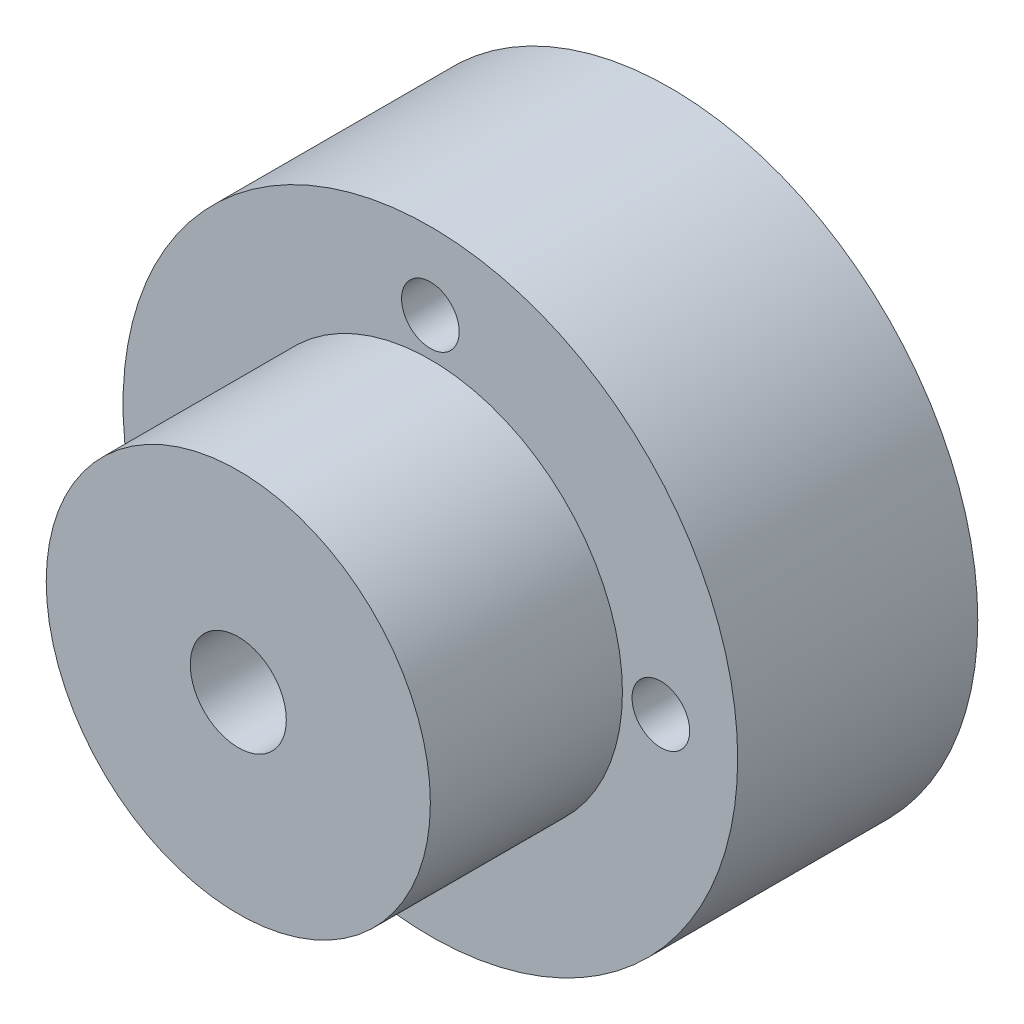
ISO-10303-21;
HEADER;
FILE_DESCRIPTION(('STEP AP214'),'2;1');
FILE_NAME('part.step','',(''),(''),'','','');
FILE_SCHEMA(('AUTOMOTIVE_DESIGN { 1 0 10303 214 1 1 1 1 }'));
ENDSEC;
DATA;
#1=APPLICATION_CONTEXT('core data for automotive mechanical design processes');
#2=APPLICATION_PROTOCOL_DEFINITION('international standard','automotive_design',2000,#1);
#3=PRODUCT_CONTEXT('',#1,'mechanical');
#4=PRODUCT('Part','Part','',(#3));
#5=PRODUCT_RELATED_PRODUCT_CATEGORY('part','',(#4));
#6=PRODUCT_DEFINITION_FORMATION('','',#4);
#7=PRODUCT_DEFINITION_CONTEXT('part definition',#1,'design');
#8=PRODUCT_DEFINITION('design','',#6,#7);
#9=PRODUCT_DEFINITION_SHAPE('','',#8);
#10=(LENGTH_UNIT() NAMED_UNIT(*) SI_UNIT(.MILLI.,.METRE.));
#11=(NAMED_UNIT(*) PLANE_ANGLE_UNIT() SI_UNIT($,.RADIAN.));
#12=(NAMED_UNIT(*) SI_UNIT($,.STERADIAN.) SOLID_ANGLE_UNIT());
#13=UNCERTAINTY_MEASURE_WITH_UNIT(LENGTH_MEASURE(1.E-05),#10,'distance_accuracy_value','');
#14=(GEOMETRIC_REPRESENTATION_CONTEXT(3) GLOBAL_UNCERTAINTY_ASSIGNED_CONTEXT((#13)) GLOBAL_UNIT_ASSIGNED_CONTEXT((#10,
#11,#12)) REPRESENTATION_CONTEXT('',''));
#15=CARTESIAN_POINT('',(0.,0.,0.));
#16=DIRECTION('',(0.,0.,1.));
#17=DIRECTION('',(1.,0.,0.));
#18=AXIS2_PLACEMENT_3D('',#15,#16,#17);
#19=CARTESIAN_POINT('',(0.,0.,12.5));
#20=DIRECTION('',(0.,0.,-1.));
#21=DIRECTION('',(-1.,0.,0.));
#22=AXIS2_PLACEMENT_3D('',#19,#20,#21);
#23=CYLINDRICAL_SURFACE('',#22,16.);
#24=CARTESIAN_POINT('',(0.,0.,12.5));
#25=DIRECTION('',(0.,0.,1.));
#26=DIRECTION('',(1.,0.,0.));
#27=AXIS2_PLACEMENT_3D('',#24,#25,#26);
#28=CIRCLE('',#27,16.);
#29=CARTESIAN_POINT('',(16.,0.,12.5));
#30=VERTEX_POINT('',#29);
#31=EDGE_CURVE('E49',#30,#30,#28,.T.);
#32=ORIENTED_EDGE('',*,*,#31,.F.);
#33=EDGE_LOOP('',(#32));
#34=FACE_BOUND('',#33,.T.);
#35=CARTESIAN_POINT('',(0.,0.,0.));
#36=DIRECTION('',(0.,0.,1.));
#37=DIRECTION('',(1.,0.,0.));
#38=AXIS2_PLACEMENT_3D('',#35,#36,#37);
#39=CIRCLE('',#38,16.);
#40=CARTESIAN_POINT('',(16.,0.,0.));
#41=VERTEX_POINT('',#40);
#42=EDGE_CURVE('E45',#41,#41,#39,.T.);
#43=ORIENTED_EDGE('',*,*,#42,.T.);
#44=EDGE_LOOP('',(#43));
#45=FACE_BOUND('',#44,.T.);
#46=ADVANCED_FACE('F42',(#34,#45),#23,.T.);
#47=CARTESIAN_POINT('',(0.,0.,12.5));
#48=DIRECTION('',(0.,0.,1.));
#49=DIRECTION('',(1.,0.,0.));
#50=AXIS2_PLACEMENT_3D('',#47,#48,#49);
#51=PLANE('',#50);
#52=CARTESIAN_POINT('',(0.,12.,12.5));
#53=DIRECTION('',(0.,0.,1.));
#54=DIRECTION('',(1.,0.,0.));
#55=AXIS2_PLACEMENT_3D('',#52,#53,#54);
#56=CIRCLE('',#55,1.5);
#57=CARTESIAN_POINT('',(-1.5,12.,12.5));
#58=VERTEX_POINT('',#57);
#59=EDGE_CURVE('E62',#58,#58,#56,.T.);
#60=ORIENTED_EDGE('',*,*,#59,.F.);
#61=EDGE_LOOP('',(#60));
#62=FACE_BOUND('',#61,.T.);
#63=CARTESIAN_POINT('',(-12.,0.,12.5));
#64=DIRECTION('',(0.,0.,1.));
#65=DIRECTION('',(1.,0.,0.));
#66=AXIS2_PLACEMENT_3D('',#63,#64,#65);
#67=CIRCLE('',#66,1.5);
#68=CARTESIAN_POINT('',(-13.5,0.,12.5));
#69=VERTEX_POINT('',#68);
#70=EDGE_CURVE('E67',#69,#69,#67,.T.);
#71=ORIENTED_EDGE('',*,*,#70,.F.);
#72=EDGE_LOOP('',(#71));
#73=FACE_BOUND('',#72,.T.);
#74=CARTESIAN_POINT('',(0.,-12.,12.5));
#75=DIRECTION('',(0.,0.,1.));
#76=DIRECTION('',(1.,0.,0.));
#77=AXIS2_PLACEMENT_3D('',#74,#75,#76);
#78=CIRCLE('',#77,1.5);
#79=CARTESIAN_POINT('',(-1.5,-12.,12.5));
#80=VERTEX_POINT('',#79);
#81=EDGE_CURVE('E70',#80,#80,#78,.T.);
#82=ORIENTED_EDGE('',*,*,#81,.F.);
#83=EDGE_LOOP('',(#82));
#84=FACE_BOUND('',#83,.T.);
#85=CARTESIAN_POINT('',(12.,0.,12.5));
#86=DIRECTION('',(0.,0.,1.));
#87=DIRECTION('',(1.,0.,0.));
#88=AXIS2_PLACEMENT_3D('',#85,#86,#87);
#89=CIRCLE('',#88,1.5);
#90=CARTESIAN_POINT('',(10.5,0.,12.5));
#91=VERTEX_POINT('',#90);
#92=EDGE_CURVE('E73',#91,#91,#89,.T.);
#93=ORIENTED_EDGE('',*,*,#92,.F.);
#94=EDGE_LOOP('',(#93));
#95=FACE_BOUND('',#94,.T.);
#96=CARTESIAN_POINT('',(0.,0.,12.5));
#97=DIRECTION('',(0.,0.,1.));
#98=DIRECTION('',(1.,0.,0.));
#99=AXIS2_PLACEMENT_3D('',#96,#97,#98);
#100=CIRCLE('',#99,10.);
#101=CARTESIAN_POINT('',(10.,0.,12.5));
#102=VERTEX_POINT('',#101);
#103=EDGE_CURVE('E10',#102,#102,#100,.T.);
#104=ORIENTED_EDGE('',*,*,#103,.F.);
#105=EDGE_LOOP('',(#104));
#106=FACE_BOUND('',#105,.T.);
#107=ORIENTED_EDGE('',*,*,#31,.T.);
#108=EDGE_LOOP('',(#107));
#109=FACE_BOUND('',#108,.T.);
#110=ADVANCED_FACE('F95',(#62,#73,#84,#95,#106,#109),#51,.T.);
#111=CARTESIAN_POINT('',(0.,0.,0.));
#112=DIRECTION('',(0.,0.,1.));
#113=DIRECTION('',(1.,0.,0.));
#114=AXIS2_PLACEMENT_3D('',#111,#112,#113);
#115=PLANE('',#114);
#116=CARTESIAN_POINT('',(0.,12.,0.));
#117=DIRECTION('',(0.,0.,-1.));
#118=DIRECTION('',(-1.,0.,0.));
#119=AXIS2_PLACEMENT_3D('',#116,#117,#118);
#120=CIRCLE('',#119,1.5);
#121=CARTESIAN_POINT('',(-1.5,12.,0.));
#122=VERTEX_POINT('',#121);
#123=EDGE_CURVE('E76',#122,#122,#120,.T.);
#124=ORIENTED_EDGE('',*,*,#123,.F.);
#125=EDGE_LOOP('',(#124));
#126=FACE_BOUND('',#125,.T.);
#127=CARTESIAN_POINT('',(-12.,0.,0.));
#128=DIRECTION('',(0.,0.,-1.));
#129=DIRECTION('',(-1.,0.,0.));
#130=AXIS2_PLACEMENT_3D('',#127,#128,#129);
#131=CIRCLE('',#130,1.5);
#132=CARTESIAN_POINT('',(-13.5,0.,0.));
#133=VERTEX_POINT('',#132);
#134=EDGE_CURVE('E83',#133,#133,#131,.T.);
#135=ORIENTED_EDGE('',*,*,#134,.F.);
#136=EDGE_LOOP('',(#135));
#137=FACE_BOUND('',#136,.T.);
#138=CARTESIAN_POINT('',(0.,-12.,0.));
#139=DIRECTION('',(0.,0.,-1.));
#140=DIRECTION('',(-1.,0.,0.));
#141=AXIS2_PLACEMENT_3D('',#138,#139,#140);
#142=CIRCLE('',#141,1.5);
#143=CARTESIAN_POINT('',(-1.5,-12.,0.));
#144=VERTEX_POINT('',#143);
#145=EDGE_CURVE('E80',#144,#144,#142,.T.);
#146=ORIENTED_EDGE('',*,*,#145,.F.);
#147=EDGE_LOOP('',(#146));
#148=FACE_BOUND('',#147,.T.);
#149=CARTESIAN_POINT('',(12.,0.,0.));
#150=DIRECTION('',(0.,0.,-1.));
#151=DIRECTION('',(-1.,0.,0.));
#152=AXIS2_PLACEMENT_3D('',#149,#150,#151);
#153=CIRCLE('',#152,1.5);
#154=CARTESIAN_POINT('',(10.5,0.,0.));
#155=VERTEX_POINT('',#154);
#156=EDGE_CURVE('E77',#155,#155,#153,.T.);
#157=ORIENTED_EDGE('',*,*,#156,.F.);
#158=EDGE_LOOP('',(#157));
#159=FACE_BOUND('',#158,.T.);
#160=CARTESIAN_POINT('',(0.,0.,0.));
#161=DIRECTION('',(0.,0.,1.));
#162=DIRECTION('',(1.,0.,0.));
#163=AXIS2_PLACEMENT_3D('',#160,#161,#162);
#164=CIRCLE('',#163,2.5);
#165=CARTESIAN_POINT('',(2.5,0.,0.));
#166=VERTEX_POINT('',#165);
#167=EDGE_CURVE('E58',#166,#166,#164,.T.);
#168=ORIENTED_EDGE('',*,*,#167,.T.);
#169=EDGE_LOOP('',(#168));
#170=FACE_BOUND('',#169,.T.);
#171=ORIENTED_EDGE('',*,*,#42,.F.);
#172=EDGE_LOOP('',(#171));
#173=FACE_BOUND('',#172,.T.);
#174=ADVANCED_FACE('F91',(#126,#137,#148,#159,#170,#173),#115,.F.);
#175=CARTESIAN_POINT('',(0.,0.,22.5));
#176=DIRECTION('',(0.,0.,-1.));
#177=DIRECTION('',(-1.,0.,0.));
#178=AXIS2_PLACEMENT_3D('',#175,#176,#177);
#179=CYLINDRICAL_SURFACE('',#178,10.);
#180=CARTESIAN_POINT('',(0.,0.,22.5));
#181=DIRECTION('',(0.,0.,1.));
#182=DIRECTION('',(1.,0.,0.));
#183=AXIS2_PLACEMENT_3D('',#180,#181,#182);
#184=CIRCLE('',#183,10.);
#185=CARTESIAN_POINT('',(10.,0.,22.5));
#186=VERTEX_POINT('',#185);
#187=EDGE_CURVE('E55',#186,#186,#184,.T.);
#188=ORIENTED_EDGE('',*,*,#187,.F.);
#189=EDGE_LOOP('',(#188));
#190=FACE_BOUND('',#189,.T.);
#191=ORIENTED_EDGE('',*,*,#103,.T.);
#192=EDGE_LOOP('',(#191));
#193=FACE_BOUND('',#192,.T.);
#194=ADVANCED_FACE('F94',(#190,#193),#179,.T.);
#195=CARTESIAN_POINT('',(0.,0.,22.5));
#196=DIRECTION('',(0.,0.,1.));
#197=DIRECTION('',(1.,0.,0.));
#198=AXIS2_PLACEMENT_3D('',#195,#196,#197);
#199=PLANE('',#198);
#200=CARTESIAN_POINT('',(0.,0.,22.5));
#201=DIRECTION('',(0.,0.,1.));
#202=DIRECTION('',(1.,0.,0.));
#203=AXIS2_PLACEMENT_3D('',#200,#201,#202);
#204=CIRCLE('',#203,2.5);
#205=CARTESIAN_POINT('',(2.5,0.,22.5));
#206=VERTEX_POINT('',#205);
#207=EDGE_CURVE('E59',#206,#206,#204,.T.);
#208=ORIENTED_EDGE('',*,*,#207,.F.);
#209=EDGE_LOOP('',(#208));
#210=FACE_BOUND('',#209,.T.);
#211=ORIENTED_EDGE('',*,*,#187,.T.);
#212=EDGE_LOOP('',(#211));
#213=FACE_BOUND('',#212,.T.);
#214=ADVANCED_FACE('F123',(#210,#213),#199,.T.);
#215=CARTESIAN_POINT('',(0.,0.,0.));
#216=DIRECTION('',(0.,0.,1.));
#217=DIRECTION('',(1.,0.,0.));
#218=AXIS2_PLACEMENT_3D('',#215,#216,#217);
#219=CYLINDRICAL_SURFACE('',#218,2.5);
#220=CARTESIAN_POINT('',(2.5,0.,0.));
#221=CARTESIAN_POINT('',(2.5,0.,0.234374999999999));
#222=CARTESIAN_POINT('',(2.5,0.,0.46875));
#223=CARTESIAN_POINT('',(2.5,0.,0.9375));
#224=CARTESIAN_POINT('',(2.5,0.,1.171875));
#225=CARTESIAN_POINT('',(2.5,0.,1.640625));
#226=CARTESIAN_POINT('',(2.5,0.,1.875));
#227=CARTESIAN_POINT('',(2.5,0.,2.34375));
#228=CARTESIAN_POINT('',(2.5,0.,2.578125));
#229=CARTESIAN_POINT('',(2.5,0.,3.046875));
#230=CARTESIAN_POINT('',(2.5,0.,3.28125));
#231=CARTESIAN_POINT('',(2.5,0.,3.75));
#232=CARTESIAN_POINT('',(2.5,0.,3.984375));
#233=CARTESIAN_POINT('',(2.5,0.,4.453125));
#234=CARTESIAN_POINT('',(2.5,0.,4.6875));
#235=CARTESIAN_POINT('',(2.5,0.,5.15625));
#236=CARTESIAN_POINT('',(2.5,0.,5.390625));
#237=CARTESIAN_POINT('',(2.5,0.,5.859375));
#238=CARTESIAN_POINT('',(2.5,0.,6.09375));
#239=CARTESIAN_POINT('',(2.5,0.,6.5625));
#240=CARTESIAN_POINT('',(2.5,0.,6.796875));
#241=CARTESIAN_POINT('',(2.5,0.,7.265625));
#242=CARTESIAN_POINT('',(2.5,0.,7.5));
#243=CARTESIAN_POINT('',(2.5,0.,7.96875));
#244=CARTESIAN_POINT('',(2.5,0.,8.203125));
#245=CARTESIAN_POINT('',(2.5,0.,8.671875));
#246=CARTESIAN_POINT('',(2.5,0.,8.90625));
#247=CARTESIAN_POINT('',(2.5,0.,9.375));
#248=CARTESIAN_POINT('',(2.5,0.,9.609375));
#249=CARTESIAN_POINT('',(2.5,0.,10.078125));
#250=CARTESIAN_POINT('',(2.5,0.,10.3125));
#251=CARTESIAN_POINT('',(2.5,0.,10.78125));
#252=CARTESIAN_POINT('',(2.5,0.,11.015625));
#253=CARTESIAN_POINT('',(2.5,0.,11.484375));
#254=CARTESIAN_POINT('',(2.5,0.,11.71875));
#255=CARTESIAN_POINT('',(2.5,0.,12.1875));
#256=CARTESIAN_POINT('',(2.5,0.,12.421875));
#257=CARTESIAN_POINT('',(2.5,0.,12.890625));
#258=CARTESIAN_POINT('',(2.5,0.,13.125));
#259=CARTESIAN_POINT('',(2.5,0.,13.59375));
#260=CARTESIAN_POINT('',(2.5,0.,13.828125));
#261=CARTESIAN_POINT('',(2.5,0.,14.296875));
#262=CARTESIAN_POINT('',(2.5,0.,14.53125));
#263=CARTESIAN_POINT('',(2.5,0.,15.));
#264=CARTESIAN_POINT('',(2.5,0.,15.234375));
#265=CARTESIAN_POINT('',(2.5,0.,15.703125));
#266=CARTESIAN_POINT('',(2.5,0.,15.9375));
#267=CARTESIAN_POINT('',(2.5,0.,16.40625));
#268=CARTESIAN_POINT('',(2.5,0.,16.640625));
#269=CARTESIAN_POINT('',(2.5,0.,17.109375));
#270=CARTESIAN_POINT('',(2.5,0.,17.34375));
#271=CARTESIAN_POINT('',(2.5,0.,17.8125));
#272=CARTESIAN_POINT('',(2.5,0.,18.046875));
#273=CARTESIAN_POINT('',(2.5,0.,18.515625));
#274=CARTESIAN_POINT('',(2.5,0.,18.75));
#275=CARTESIAN_POINT('',(2.5,0.,19.21875));
#276=CARTESIAN_POINT('',(2.5,0.,19.453125));
#277=CARTESIAN_POINT('',(2.5,0.,19.921875));
#278=CARTESIAN_POINT('',(2.5,0.,20.15625));
#279=CARTESIAN_POINT('',(2.5,0.,20.625));
#280=CARTESIAN_POINT('',(2.5,0.,20.859375));
#281=CARTESIAN_POINT('',(2.5,0.,21.328125));
#282=CARTESIAN_POINT('',(2.5,0.,21.5625));
#283=CARTESIAN_POINT('',(2.5,0.,22.03125));
#284=CARTESIAN_POINT('',(2.5,0.,22.265625));
#285=CARTESIAN_POINT('',(2.5,0.,22.5));
#286=B_SPLINE_CURVE_WITH_KNOTS('',3,(#220,#221,#222,#223,#224,#225,#226,#227,#228,#229,#230,
#231,#232,#233,#234,#235,#236,#237,#238,#239,#240,#241,#242,#243,#244,#245,#246,#247,#248,#249,
#250,#251,#252,#253,#254,#255,#256,#257,#258,#259,#260,#261,#262,#263,#264,#265,#266,#267,#268,
#269,#270,#271,#272,#273,#274,#275,#276,#277,#278,#279,#280,#281,#282,#283,#284,#285),
.UNSPECIFIED.,.F.,.F.,(4,2,2,2,2,2,2,2,2,2,2,2,2,2,2,2,2,2,2,2,2,2,2,2,2,2,2,2,2,2,2,2,4),(0.,
0.703125,1.40625,2.109375,2.8125,3.515625,4.21875,4.921875,5.625,6.328125,7.03125,7.734375,
8.4375,9.140625,9.84375,10.546875,11.25,11.953125,12.65625,13.359375,14.0625,14.765625,15.46875,
16.171875,16.875,17.578125,18.28125,18.984375,19.6875,20.390625,21.09375,21.796875,22.5),.UNSPECIFIED.);
#287=EDGE_CURVE('BSEAM127',#166,#206,#286,.T.);
#288=ORIENTED_EDGE('',*,*,#167,.F.);
#289=ORIENTED_EDGE('',*,*,#207,.T.);
#290=ORIENTED_EDGE('',*,*,#287,.T.);
#291=ORIENTED_EDGE('',*,*,#287,.F.);
#292=EDGE_LOOP('',(#288,#290,#289,#291));
#293=FACE_BOUND('',#292,.T.);
#294=ADVANCED_FACE('F127',(#293),#219,.F.);
#295=CARTESIAN_POINT('',(12.,0.,22.5));
#296=DIRECTION('',(0.,0.,-1.));
#297=DIRECTION('',(-1.,0.,0.));
#298=AXIS2_PLACEMENT_3D('',#295,#296,#297);
#299=CYLINDRICAL_SURFACE('',#298,1.5);
#300=CARTESIAN_POINT('',(10.5,0.,12.5));
#301=CARTESIAN_POINT('',(10.5,0.,12.3697916666667));
#302=CARTESIAN_POINT('',(10.5,0.,12.2395833333333));
#303=CARTESIAN_POINT('',(10.5,0.,11.9791666666667));
#304=CARTESIAN_POINT('',(10.5,0.,11.8489583333333));
#305=CARTESIAN_POINT('',(10.5,0.,11.5885416666667));
#306=CARTESIAN_POINT('',(10.5,0.,11.4583333333333));
#307=CARTESIAN_POINT('',(10.5,0.,11.1979166666667));
#308=CARTESIAN_POINT('',(10.5,0.,11.0677083333333));
#309=CARTESIAN_POINT('',(10.5,0.,10.8072916666667));
#310=CARTESIAN_POINT('',(10.5,0.,10.6770833333333));
#311=CARTESIAN_POINT('',(10.5,0.,10.4166666666667));
#312=CARTESIAN_POINT('',(10.5,0.,10.2864583333333));
#313=CARTESIAN_POINT('',(10.5,0.,10.0260416666667));
#314=CARTESIAN_POINT('',(10.5,0.,9.89583333333333));
#315=CARTESIAN_POINT('',(10.5,0.,9.63541666666667));
#316=CARTESIAN_POINT('',(10.5,0.,9.50520833333333));
#317=CARTESIAN_POINT('',(10.5,0.,9.24479166666667));
#318=CARTESIAN_POINT('',(10.5,0.,9.11458333333333));
#319=CARTESIAN_POINT('',(10.5,0.,8.85416666666667));
#320=CARTESIAN_POINT('',(10.5,0.,8.72395833333333));
#321=CARTESIAN_POINT('',(10.5,0.,8.46354166666667));
#322=CARTESIAN_POINT('',(10.5,0.,8.33333333333333));
#323=CARTESIAN_POINT('',(10.5,0.,8.07291666666667));
#324=CARTESIAN_POINT('',(10.5,0.,7.94270833333333));
#325=CARTESIAN_POINT('',(10.5,0.,7.68229166666667));
#326=CARTESIAN_POINT('',(10.5,0.,7.55208333333333));
#327=CARTESIAN_POINT('',(10.5,0.,7.29166666666667));
#328=CARTESIAN_POINT('',(10.5,0.,7.16145833333333));
#329=CARTESIAN_POINT('',(10.5,0.,6.90104166666667));
#330=CARTESIAN_POINT('',(10.5,0.,6.77083333333333));
#331=CARTESIAN_POINT('',(10.5,0.,6.51041666666667));
#332=CARTESIAN_POINT('',(10.5,0.,6.38020833333333));
#333=CARTESIAN_POINT('',(10.5,0.,6.11979166666667));
#334=CARTESIAN_POINT('',(10.5,0.,5.98958333333334));
#335=CARTESIAN_POINT('',(10.5,0.,5.72916666666667));
#336=CARTESIAN_POINT('',(10.5,0.,5.59895833333333));
#337=CARTESIAN_POINT('',(10.5,0.,5.33854166666667));
#338=CARTESIAN_POINT('',(10.5,0.,5.20833333333334));
#339=CARTESIAN_POINT('',(10.5,0.,4.94791666666667));
#340=CARTESIAN_POINT('',(10.5,0.,4.81770833333333));
#341=CARTESIAN_POINT('',(10.5,0.,4.55729166666667));
#342=CARTESIAN_POINT('',(10.5,0.,4.42708333333333));
#343=CARTESIAN_POINT('',(10.5,0.,4.16666666666667));
#344=CARTESIAN_POINT('',(10.5,0.,4.03645833333334));
#345=CARTESIAN_POINT('',(10.5,0.,3.77604166666667));
#346=CARTESIAN_POINT('',(10.5,0.,3.64583333333334));
#347=CARTESIAN_POINT('',(10.5,0.,3.38541666666667));
#348=CARTESIAN_POINT('',(10.5,0.,3.25520833333334));
#349=CARTESIAN_POINT('',(10.5,0.,2.99479166666667));
#350=CARTESIAN_POINT('',(10.5,0.,2.86458333333333));
#351=CARTESIAN_POINT('',(10.5,0.,2.60416666666667));
#352=CARTESIAN_POINT('',(10.5,0.,2.47395833333333));
#353=CARTESIAN_POINT('',(10.5,0.,2.21354166666667));
#354=CARTESIAN_POINT('',(10.5,0.,2.08333333333334));
#355=CARTESIAN_POINT('',(10.5,0.,1.82291666666667));
#356=CARTESIAN_POINT('',(10.5,0.,1.69270833333334));
#357=CARTESIAN_POINT('',(10.5,0.,1.43229166666667));
#358=CARTESIAN_POINT('',(10.5,0.,1.30208333333334));
#359=CARTESIAN_POINT('',(10.5,0.,1.04166666666667));
#360=CARTESIAN_POINT('',(10.5,0.,0.911458333333337));
#361=CARTESIAN_POINT('',(10.5,0.,0.65104166666667));
#362=CARTESIAN_POINT('',(10.5,0.,0.520833333333336));
#363=CARTESIAN_POINT('',(10.5,0.,0.260416666666669));
#364=CARTESIAN_POINT('',(10.5,0.,0.130208333333336));
#365=CARTESIAN_POINT('',(10.5,0.,0.));
#366=B_SPLINE_CURVE_WITH_KNOTS('',3,(#300,#301,#302,#303,#304,#305,#306,#307,#308,#309,#310,
#311,#312,#313,#314,#315,#316,#317,#318,#319,#320,#321,#322,#323,#324,#325,#326,#327,#328,#329,
#330,#331,#332,#333,#334,#335,#336,#337,#338,#339,#340,#341,#342,#343,#344,#345,#346,#347,#348,
#349,#350,#351,#352,#353,#354,#355,#356,#357,#358,#359,#360,#361,#362,#363,#364,#365),
.UNSPECIFIED.,.F.,.F.,(4,2,2,2,2,2,2,2,2,2,2,2,2,2,2,2,2,2,2,2,2,2,2,2,2,2,2,2,2,2,2,2,4),(0.,
0.390625,0.781250000000001,1.171875,1.5625,1.953125,2.34375,2.734375,3.125,3.515625,3.90625,
4.296875,4.6875,5.078125,5.46875,5.859375,6.25,6.640625,7.03125,7.421875,7.8125,8.203125,
8.59374999999999,8.98437499999999,9.375,9.765625,10.15625,10.546875,10.9375,11.328125,11.71875,
12.109375,12.5),.UNSPECIFIED.);
#367=EDGE_CURVE('BSEAM131',#91,#155,#366,.T.);
#368=ORIENTED_EDGE('',*,*,#92,.T.);
#369=ORIENTED_EDGE('',*,*,#156,.T.);
#370=ORIENTED_EDGE('',*,*,#367,.T.);
#371=ORIENTED_EDGE('',*,*,#367,.F.);
#372=EDGE_LOOP('',(#368,#370,#369,#371));
#373=FACE_BOUND('',#372,.T.);
#374=ADVANCED_FACE('F131',(#373),#299,.F.);
#375=CARTESIAN_POINT('',(0.,-12.,22.5));
#376=DIRECTION('',(0.,0.,-1.));
#377=DIRECTION('',(-1.,0.,0.));
#378=AXIS2_PLACEMENT_3D('',#375,#376,#377);
#379=CYLINDRICAL_SURFACE('',#378,1.5);
#380=CARTESIAN_POINT('',(-1.5,-12.,12.5));
#381=CARTESIAN_POINT('',(-1.5,-12.,12.3697916666667));
#382=CARTESIAN_POINT('',(-1.5,-12.,12.2395833333333));
#383=CARTESIAN_POINT('',(-1.5,-12.,11.9791666666667));
#384=CARTESIAN_POINT('',(-1.5,-12.,11.8489583333333));
#385=CARTESIAN_POINT('',(-1.5,-12.,11.5885416666667));
#386=CARTESIAN_POINT('',(-1.5,-12.,11.4583333333333));
#387=CARTESIAN_POINT('',(-1.5,-12.,11.1979166666667));
#388=CARTESIAN_POINT('',(-1.5,-12.,11.0677083333333));
#389=CARTESIAN_POINT('',(-1.5,-12.,10.8072916666667));
#390=CARTESIAN_POINT('',(-1.5,-12.,10.6770833333333));
#391=CARTESIAN_POINT('',(-1.5,-12.,10.4166666666667));
#392=CARTESIAN_POINT('',(-1.5,-12.,10.2864583333333));
#393=CARTESIAN_POINT('',(-1.5,-12.,10.0260416666667));
#394=CARTESIAN_POINT('',(-1.5,-12.,9.89583333333333));
#395=CARTESIAN_POINT('',(-1.5,-12.,9.63541666666667));
#396=CARTESIAN_POINT('',(-1.5,-12.,9.50520833333333));
#397=CARTESIAN_POINT('',(-1.5,-12.,9.24479166666667));
#398=CARTESIAN_POINT('',(-1.5,-12.,9.11458333333333));
#399=CARTESIAN_POINT('',(-1.5,-12.,8.85416666666667));
#400=CARTESIAN_POINT('',(-1.5,-12.,8.72395833333333));
#401=CARTESIAN_POINT('',(-1.5,-12.,8.46354166666667));
#402=CARTESIAN_POINT('',(-1.5,-12.,8.33333333333333));
#403=CARTESIAN_POINT('',(-1.5,-12.,8.07291666666667));
#404=CARTESIAN_POINT('',(-1.5,-12.,7.94270833333333));
#405=CARTESIAN_POINT('',(-1.5,-12.,7.68229166666667));
#406=CARTESIAN_POINT('',(-1.5,-12.,7.55208333333333));
#407=CARTESIAN_POINT('',(-1.5,-12.,7.29166666666667));
#408=CARTESIAN_POINT('',(-1.5,-12.,7.16145833333333));
#409=CARTESIAN_POINT('',(-1.5,-12.,6.90104166666667));
#410=CARTESIAN_POINT('',(-1.5,-12.,6.77083333333333));
#411=CARTESIAN_POINT('',(-1.5,-12.,6.51041666666667));
#412=CARTESIAN_POINT('',(-1.5,-12.,6.38020833333333));
#413=CARTESIAN_POINT('',(-1.5,-12.,6.11979166666667));
#414=CARTESIAN_POINT('',(-1.5,-12.,5.98958333333334));
#415=CARTESIAN_POINT('',(-1.5,-12.,5.72916666666667));
#416=CARTESIAN_POINT('',(-1.5,-12.,5.59895833333333));
#417=CARTESIAN_POINT('',(-1.5,-12.,5.33854166666667));
#418=CARTESIAN_POINT('',(-1.5,-12.,5.20833333333334));
#419=CARTESIAN_POINT('',(-1.5,-12.,4.94791666666667));
#420=CARTESIAN_POINT('',(-1.5,-12.,4.81770833333333));
#421=CARTESIAN_POINT('',(-1.5,-12.,4.55729166666667));
#422=CARTESIAN_POINT('',(-1.5,-12.,4.42708333333333));
#423=CARTESIAN_POINT('',(-1.5,-12.,4.16666666666667));
#424=CARTESIAN_POINT('',(-1.5,-12.,4.03645833333334));
#425=CARTESIAN_POINT('',(-1.5,-12.,3.77604166666667));
#426=CARTESIAN_POINT('',(-1.5,-12.,3.64583333333334));
#427=CARTESIAN_POINT('',(-1.5,-12.,3.38541666666667));
#428=CARTESIAN_POINT('',(-1.5,-12.,3.25520833333334));
#429=CARTESIAN_POINT('',(-1.5,-12.,2.99479166666667));
#430=CARTESIAN_POINT('',(-1.5,-12.,2.86458333333333));
#431=CARTESIAN_POINT('',(-1.5,-12.,2.60416666666667));
#432=CARTESIAN_POINT('',(-1.5,-12.,2.47395833333333));
#433=CARTESIAN_POINT('',(-1.5,-12.,2.21354166666667));
#434=CARTESIAN_POINT('',(-1.5,-12.,2.08333333333334));
#435=CARTESIAN_POINT('',(-1.5,-12.,1.82291666666667));
#436=CARTESIAN_POINT('',(-1.5,-12.,1.69270833333334));
#437=CARTESIAN_POINT('',(-1.5,-12.,1.43229166666667));
#438=CARTESIAN_POINT('',(-1.5,-12.,1.30208333333334));
#439=CARTESIAN_POINT('',(-1.5,-12.,1.04166666666667));
#440=CARTESIAN_POINT('',(-1.5,-12.,0.911458333333337));
#441=CARTESIAN_POINT('',(-1.5,-12.,0.65104166666667));
#442=CARTESIAN_POINT('',(-1.5,-12.,0.520833333333336));
#443=CARTESIAN_POINT('',(-1.5,-12.,0.260416666666669));
#444=CARTESIAN_POINT('',(-1.5,-12.,0.130208333333336));
#445=CARTESIAN_POINT('',(-1.5,-12.,0.));
#446=B_SPLINE_CURVE_WITH_KNOTS('',3,(#380,#381,#382,#383,#384,#385,#386,#387,#388,#389,#390,
#391,#392,#393,#394,#395,#396,#397,#398,#399,#400,#401,#402,#403,#404,#405,#406,#407,#408,#409,
#410,#411,#412,#413,#414,#415,#416,#417,#418,#419,#420,#421,#422,#423,#424,#425,#426,#427,#428,
#429,#430,#431,#432,#433,#434,#435,#436,#437,#438,#439,#440,#441,#442,#443,#444,#445),
.UNSPECIFIED.,.F.,.F.,(4,2,2,2,2,2,2,2,2,2,2,2,2,2,2,2,2,2,2,2,2,2,2,2,2,2,2,2,2,2,2,2,4),(0.,
0.390625,0.781250000000001,1.171875,1.5625,1.953125,2.34375,2.734375,3.125,3.515625,3.90625,
4.296875,4.6875,5.078125,5.46875,5.859375,6.25,6.640625,7.03125,7.421875,7.8125,8.203125,
8.59374999999999,8.98437499999999,9.375,9.765625,10.15625,10.546875,10.9375,11.328125,11.71875,
12.109375,12.5),.UNSPECIFIED.);
#447=EDGE_CURVE('BSEAM135',#80,#144,#446,.T.);
#448=ORIENTED_EDGE('',*,*,#81,.T.);
#449=ORIENTED_EDGE('',*,*,#145,.T.);
#450=ORIENTED_EDGE('',*,*,#447,.T.);
#451=ORIENTED_EDGE('',*,*,#447,.F.);
#452=EDGE_LOOP('',(#448,#450,#449,#451));
#453=FACE_BOUND('',#452,.T.);
#454=ADVANCED_FACE('F135',(#453),#379,.F.);
#455=CARTESIAN_POINT('',(-12.,0.,22.5));
#456=DIRECTION('',(0.,0.,-1.));
#457=DIRECTION('',(-1.,0.,0.));
#458=AXIS2_PLACEMENT_3D('',#455,#456,#457);
#459=CYLINDRICAL_SURFACE('',#458,1.5);
#460=CARTESIAN_POINT('',(-13.5,0.,12.5));
#461=CARTESIAN_POINT('',(-13.5,0.,12.3697916666667));
#462=CARTESIAN_POINT('',(-13.5,0.,12.2395833333333));
#463=CARTESIAN_POINT('',(-13.5,0.,11.9791666666667));
#464=CARTESIAN_POINT('',(-13.5,0.,11.8489583333333));
#465=CARTESIAN_POINT('',(-13.5,0.,11.5885416666667));
#466=CARTESIAN_POINT('',(-13.5,0.,11.4583333333333));
#467=CARTESIAN_POINT('',(-13.5,0.,11.1979166666667));
#468=CARTESIAN_POINT('',(-13.5,0.,11.0677083333333));
#469=CARTESIAN_POINT('',(-13.5,0.,10.8072916666667));
#470=CARTESIAN_POINT('',(-13.5,0.,10.6770833333333));
#471=CARTESIAN_POINT('',(-13.5,0.,10.4166666666667));
#472=CARTESIAN_POINT('',(-13.5,0.,10.2864583333333));
#473=CARTESIAN_POINT('',(-13.5,0.,10.0260416666667));
#474=CARTESIAN_POINT('',(-13.5,0.,9.89583333333333));
#475=CARTESIAN_POINT('',(-13.5,0.,9.63541666666667));
#476=CARTESIAN_POINT('',(-13.5,0.,9.50520833333333));
#477=CARTESIAN_POINT('',(-13.5,0.,9.24479166666667));
#478=CARTESIAN_POINT('',(-13.5,0.,9.11458333333333));
#479=CARTESIAN_POINT('',(-13.5,0.,8.85416666666667));
#480=CARTESIAN_POINT('',(-13.5,0.,8.72395833333333));
#481=CARTESIAN_POINT('',(-13.5,0.,8.46354166666667));
#482=CARTESIAN_POINT('',(-13.5,0.,8.33333333333333));
#483=CARTESIAN_POINT('',(-13.5,0.,8.07291666666667));
#484=CARTESIAN_POINT('',(-13.5,0.,7.94270833333333));
#485=CARTESIAN_POINT('',(-13.5,0.,7.68229166666667));
#486=CARTESIAN_POINT('',(-13.5,0.,7.55208333333333));
#487=CARTESIAN_POINT('',(-13.5,0.,7.29166666666667));
#488=CARTESIAN_POINT('',(-13.5,0.,7.16145833333333));
#489=CARTESIAN_POINT('',(-13.5,0.,6.90104166666667));
#490=CARTESIAN_POINT('',(-13.5,0.,6.77083333333333));
#491=CARTESIAN_POINT('',(-13.5,0.,6.51041666666667));
#492=CARTESIAN_POINT('',(-13.5,0.,6.38020833333333));
#493=CARTESIAN_POINT('',(-13.5,0.,6.11979166666667));
#494=CARTESIAN_POINT('',(-13.5,0.,5.98958333333334));
#495=CARTESIAN_POINT('',(-13.5,0.,5.72916666666667));
#496=CARTESIAN_POINT('',(-13.5,0.,5.59895833333333));
#497=CARTESIAN_POINT('',(-13.5,0.,5.33854166666667));
#498=CARTESIAN_POINT('',(-13.5,0.,5.20833333333334));
#499=CARTESIAN_POINT('',(-13.5,0.,4.94791666666667));
#500=CARTESIAN_POINT('',(-13.5,0.,4.81770833333333));
#501=CARTESIAN_POINT('',(-13.5,0.,4.55729166666667));
#502=CARTESIAN_POINT('',(-13.5,0.,4.42708333333333));
#503=CARTESIAN_POINT('',(-13.5,0.,4.16666666666667));
#504=CARTESIAN_POINT('',(-13.5,0.,4.03645833333334));
#505=CARTESIAN_POINT('',(-13.5,0.,3.77604166666667));
#506=CARTESIAN_POINT('',(-13.5,0.,3.64583333333334));
#507=CARTESIAN_POINT('',(-13.5,0.,3.38541666666667));
#508=CARTESIAN_POINT('',(-13.5,0.,3.25520833333334));
#509=CARTESIAN_POINT('',(-13.5,0.,2.99479166666667));
#510=CARTESIAN_POINT('',(-13.5,0.,2.86458333333333));
#511=CARTESIAN_POINT('',(-13.5,0.,2.60416666666667));
#512=CARTESIAN_POINT('',(-13.5,0.,2.47395833333333));
#513=CARTESIAN_POINT('',(-13.5,0.,2.21354166666667));
#514=CARTESIAN_POINT('',(-13.5,0.,2.08333333333334));
#515=CARTESIAN_POINT('',(-13.5,0.,1.82291666666667));
#516=CARTESIAN_POINT('',(-13.5,0.,1.69270833333334));
#517=CARTESIAN_POINT('',(-13.5,0.,1.43229166666667));
#518=CARTESIAN_POINT('',(-13.5,0.,1.30208333333334));
#519=CARTESIAN_POINT('',(-13.5,0.,1.04166666666667));
#520=CARTESIAN_POINT('',(-13.5,0.,0.911458333333337));
#521=CARTESIAN_POINT('',(-13.5,0.,0.65104166666667));
#522=CARTESIAN_POINT('',(-13.5,0.,0.520833333333336));
#523=CARTESIAN_POINT('',(-13.5,0.,0.260416666666669));
#524=CARTESIAN_POINT('',(-13.5,0.,0.130208333333336));
#525=CARTESIAN_POINT('',(-13.5,0.,0.));
#526=B_SPLINE_CURVE_WITH_KNOTS('',3,(#460,#461,#462,#463,#464,#465,#466,#467,#468,#469,#470,
#471,#472,#473,#474,#475,#476,#477,#478,#479,#480,#481,#482,#483,#484,#485,#486,#487,#488,#489,
#490,#491,#492,#493,#494,#495,#496,#497,#498,#499,#500,#501,#502,#503,#504,#505,#506,#507,#508,
#509,#510,#511,#512,#513,#514,#515,#516,#517,#518,#519,#520,#521,#522,#523,#524,#525),
.UNSPECIFIED.,.F.,.F.,(4,2,2,2,2,2,2,2,2,2,2,2,2,2,2,2,2,2,2,2,2,2,2,2,2,2,2,2,2,2,2,2,4),(0.,
0.390625,0.781250000000001,1.171875,1.5625,1.953125,2.34375,2.734375,3.125,3.515625,3.90625,
4.296875,4.6875,5.078125,5.46875,5.859375,6.25,6.640625,7.03125,7.421875,7.8125,8.203125,
8.59374999999999,8.98437499999999,9.375,9.765625,10.15625,10.546875,10.9375,11.328125,11.71875,
12.109375,12.5),.UNSPECIFIED.);
#527=EDGE_CURVE('BSEAM139',#69,#133,#526,.T.);
#528=ORIENTED_EDGE('',*,*,#70,.T.);
#529=ORIENTED_EDGE('',*,*,#134,.T.);
#530=ORIENTED_EDGE('',*,*,#527,.T.);
#531=ORIENTED_EDGE('',*,*,#527,.F.);
#532=EDGE_LOOP('',(#528,#530,#529,#531));
#533=FACE_BOUND('',#532,.T.);
#534=ADVANCED_FACE('F139',(#533),#459,.F.);
#535=CARTESIAN_POINT('',(0.,12.,22.5));
#536=DIRECTION('',(0.,0.,-1.));
#537=DIRECTION('',(-1.,0.,0.));
#538=AXIS2_PLACEMENT_3D('',#535,#536,#537);
#539=CYLINDRICAL_SURFACE('',#538,1.5);
#540=CARTESIAN_POINT('',(-1.5,12.,12.5));
#541=CARTESIAN_POINT('',(-1.5,12.,12.3697916666667));
#542=CARTESIAN_POINT('',(-1.5,12.,12.2395833333333));
#543=CARTESIAN_POINT('',(-1.5,12.,11.9791666666667));
#544=CARTESIAN_POINT('',(-1.5,12.,11.8489583333333));
#545=CARTESIAN_POINT('',(-1.5,12.,11.5885416666667));
#546=CARTESIAN_POINT('',(-1.5,12.,11.4583333333333));
#547=CARTESIAN_POINT('',(-1.5,12.,11.1979166666667));
#548=CARTESIAN_POINT('',(-1.5,12.,11.0677083333333));
#549=CARTESIAN_POINT('',(-1.5,12.,10.8072916666667));
#550=CARTESIAN_POINT('',(-1.5,12.,10.6770833333333));
#551=CARTESIAN_POINT('',(-1.5,12.,10.4166666666667));
#552=CARTESIAN_POINT('',(-1.5,12.,10.2864583333333));
#553=CARTESIAN_POINT('',(-1.5,12.,10.0260416666667));
#554=CARTESIAN_POINT('',(-1.5,12.,9.89583333333333));
#555=CARTESIAN_POINT('',(-1.5,12.,9.63541666666667));
#556=CARTESIAN_POINT('',(-1.5,12.,9.50520833333333));
#557=CARTESIAN_POINT('',(-1.5,12.,9.24479166666667));
#558=CARTESIAN_POINT('',(-1.5,12.,9.11458333333333));
#559=CARTESIAN_POINT('',(-1.5,12.,8.85416666666667));
#560=CARTESIAN_POINT('',(-1.5,12.,8.72395833333333));
#561=CARTESIAN_POINT('',(-1.5,12.,8.46354166666667));
#562=CARTESIAN_POINT('',(-1.5,12.,8.33333333333333));
#563=CARTESIAN_POINT('',(-1.5,12.,8.07291666666667));
#564=CARTESIAN_POINT('',(-1.5,12.,7.94270833333333));
#565=CARTESIAN_POINT('',(-1.5,12.,7.68229166666667));
#566=CARTESIAN_POINT('',(-1.5,12.,7.55208333333333));
#567=CARTESIAN_POINT('',(-1.5,12.,7.29166666666667));
#568=CARTESIAN_POINT('',(-1.5,12.,7.16145833333333));
#569=CARTESIAN_POINT('',(-1.5,12.,6.90104166666667));
#570=CARTESIAN_POINT('',(-1.5,12.,6.77083333333333));
#571=CARTESIAN_POINT('',(-1.5,12.,6.51041666666667));
#572=CARTESIAN_POINT('',(-1.5,12.,6.38020833333333));
#573=CARTESIAN_POINT('',(-1.5,12.,6.11979166666667));
#574=CARTESIAN_POINT('',(-1.5,12.,5.98958333333334));
#575=CARTESIAN_POINT('',(-1.5,12.,5.72916666666667));
#576=CARTESIAN_POINT('',(-1.5,12.,5.59895833333333));
#577=CARTESIAN_POINT('',(-1.5,12.,5.33854166666667));
#578=CARTESIAN_POINT('',(-1.5,12.,5.20833333333334));
#579=CARTESIAN_POINT('',(-1.5,12.,4.94791666666667));
#580=CARTESIAN_POINT('',(-1.5,12.,4.81770833333333));
#581=CARTESIAN_POINT('',(-1.5,12.,4.55729166666667));
#582=CARTESIAN_POINT('',(-1.5,12.,4.42708333333333));
#583=CARTESIAN_POINT('',(-1.5,12.,4.16666666666667));
#584=CARTESIAN_POINT('',(-1.5,12.,4.03645833333334));
#585=CARTESIAN_POINT('',(-1.5,12.,3.77604166666667));
#586=CARTESIAN_POINT('',(-1.5,12.,3.64583333333334));
#587=CARTESIAN_POINT('',(-1.5,12.,3.38541666666667));
#588=CARTESIAN_POINT('',(-1.5,12.,3.25520833333334));
#589=CARTESIAN_POINT('',(-1.5,12.,2.99479166666667));
#590=CARTESIAN_POINT('',(-1.5,12.,2.86458333333333));
#591=CARTESIAN_POINT('',(-1.5,12.,2.60416666666667));
#592=CARTESIAN_POINT('',(-1.5,12.,2.47395833333333));
#593=CARTESIAN_POINT('',(-1.5,12.,2.21354166666667));
#594=CARTESIAN_POINT('',(-1.5,12.,2.08333333333334));
#595=CARTESIAN_POINT('',(-1.5,12.,1.82291666666667));
#596=CARTESIAN_POINT('',(-1.5,12.,1.69270833333334));
#597=CARTESIAN_POINT('',(-1.5,12.,1.43229166666667));
#598=CARTESIAN_POINT('',(-1.5,12.,1.30208333333334));
#599=CARTESIAN_POINT('',(-1.5,12.,1.04166666666667));
#600=CARTESIAN_POINT('',(-1.5,12.,0.911458333333337));
#601=CARTESIAN_POINT('',(-1.5,12.,0.65104166666667));
#602=CARTESIAN_POINT('',(-1.5,12.,0.520833333333336));
#603=CARTESIAN_POINT('',(-1.5,12.,0.260416666666669));
#604=CARTESIAN_POINT('',(-1.5,12.,0.130208333333336));
#605=CARTESIAN_POINT('',(-1.5,12.,0.));
#606=B_SPLINE_CURVE_WITH_KNOTS('',3,(#540,#541,#542,#543,#544,#545,#546,#547,#548,#549,#550,
#551,#552,#553,#554,#555,#556,#557,#558,#559,#560,#561,#562,#563,#564,#565,#566,#567,#568,#569,
#570,#571,#572,#573,#574,#575,#576,#577,#578,#579,#580,#581,#582,#583,#584,#585,#586,#587,#588,
#589,#590,#591,#592,#593,#594,#595,#596,#597,#598,#599,#600,#601,#602,#603,#604,#605),
.UNSPECIFIED.,.F.,.F.,(4,2,2,2,2,2,2,2,2,2,2,2,2,2,2,2,2,2,2,2,2,2,2,2,2,2,2,2,2,2,2,2,4),(0.,
0.390625,0.781250000000001,1.171875,1.5625,1.953125,2.34375,2.734375,3.125,3.515625,3.90625,
4.296875,4.6875,5.078125,5.46875,5.859375,6.25,6.640625,7.03125,7.421875,7.8125,8.203125,
8.59374999999999,8.98437499999999,9.375,9.765625,10.15625,10.546875,10.9375,11.328125,11.71875,
12.109375,12.5),.UNSPECIFIED.);
#607=EDGE_CURVE('BSEAM89',#58,#122,#606,.T.);
#608=ORIENTED_EDGE('',*,*,#59,.T.);
#609=ORIENTED_EDGE('',*,*,#123,.T.);
#610=ORIENTED_EDGE('',*,*,#607,.T.);
#611=ORIENTED_EDGE('',*,*,#607,.F.);
#612=EDGE_LOOP('',(#608,#610,#609,#611));
#613=FACE_BOUND('',#612,.T.);
#614=ADVANCED_FACE('F89',(#613),#539,.F.);
#615=CLOSED_SHELL('',(#46,#110,#174,#194,#214,#294,#374,#454,#534,#614));
#616=MANIFOLD_SOLID_BREP('B2',#615);
#617=ADVANCED_BREP_SHAPE_REPRESENTATION('',(#18,#616),#14);
#618=SHAPE_DEFINITION_REPRESENTATION(#9,#617);
ENDSEC;
END-ISO-10303-21;
